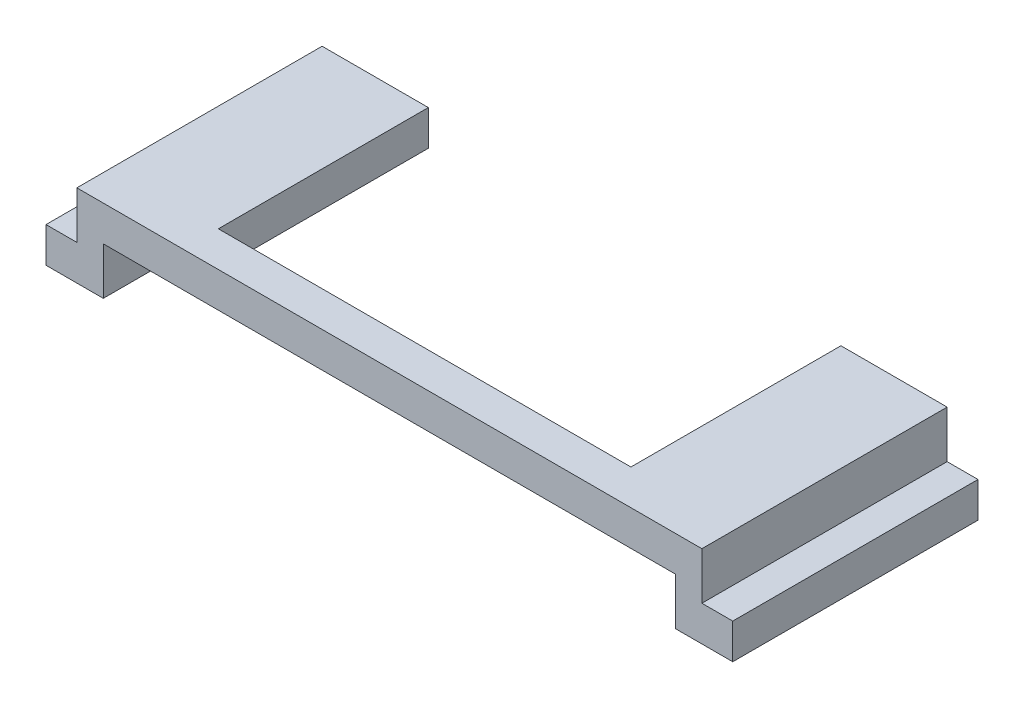
ISO-10303-21;
HEADER;
FILE_DESCRIPTION(('STEP AP214'),'2;1');
FILE_NAME('part.step','',(''),(''),'','','');
FILE_SCHEMA(('AUTOMOTIVE_DESIGN { 1 0 10303 214 1 1 1 1 }'));
ENDSEC;
DATA;
#1=APPLICATION_CONTEXT('core data for automotive mechanical design processes');
#2=APPLICATION_PROTOCOL_DEFINITION('international standard','automotive_design',2000,#1);
#3=PRODUCT_CONTEXT('',#1,'mechanical');
#4=PRODUCT('Part','Part','',(#3));
#5=PRODUCT_RELATED_PRODUCT_CATEGORY('part','',(#4));
#6=PRODUCT_DEFINITION_FORMATION('','',#4);
#7=PRODUCT_DEFINITION_CONTEXT('part definition',#1,'design');
#8=PRODUCT_DEFINITION('design','',#6,#7);
#9=PRODUCT_DEFINITION_SHAPE('','',#8);
#10=(LENGTH_UNIT() NAMED_UNIT(*) SI_UNIT(.MILLI.,.METRE.));
#11=(NAMED_UNIT(*) PLANE_ANGLE_UNIT() SI_UNIT($,.RADIAN.));
#12=(NAMED_UNIT(*) SI_UNIT($,.STERADIAN.) SOLID_ANGLE_UNIT());
#13=UNCERTAINTY_MEASURE_WITH_UNIT(LENGTH_MEASURE(1.E-05),#10,'distance_accuracy_value','');
#14=(GEOMETRIC_REPRESENTATION_CONTEXT(3) GLOBAL_UNCERTAINTY_ASSIGNED_CONTEXT((#13)) GLOBAL_UNIT_ASSIGNED_CONTEXT((#10,
#11,#12)) REPRESENTATION_CONTEXT('',''));
#15=CARTESIAN_POINT('',(0.,0.,0.));
#16=DIRECTION('',(0.,0.,1.));
#17=DIRECTION('',(1.,0.,0.));
#18=AXIS2_PLACEMENT_3D('',#15,#16,#17);
#19=CARTESIAN_POINT('',(0.,0.,0.));
#20=DIRECTION('',(0.,0.,-1.));
#21=DIRECTION('',(-1.,0.,0.));
#22=AXIS2_PLACEMENT_3D('',#19,#20,#21);
#23=PLANE('',#22);
#24=DIRECTION('',(1.,0.,0.));
#25=VECTOR('',#24,1.);
#26=CARTESIAN_POINT('',(-16.225,0.,0.));
#27=LINE('',#26,#25);
#28=CARTESIAN_POINT('',(11.7,0.,0.));
#29=VERTEX_POINT('',#28);
#30=CARTESIAN_POINT('',(16.225,0.,0.));
#31=VERTEX_POINT('',#30);
#32=EDGE_CURVE('E185',#29,#31,#27,.T.);
#33=ORIENTED_EDGE('',*,*,#32,.F.);
#34=DIRECTION('',(0.,1.,0.));
#35=VECTOR('',#34,1.);
#36=CARTESIAN_POINT('',(11.7,-2.68100000000001,0.));
#37=LINE('',#36,#35);
#38=CARTESIAN_POINT('',(11.7,2.,0.));
#39=VERTEX_POINT('',#38);
#40=EDGE_CURVE('E261',#29,#39,#37,.T.);
#41=ORIENTED_EDGE('',*,*,#40,.T.);
#42=DIRECTION('',(-1.,0.,0.));
#43=VECTOR('',#42,1.);
#44=CARTESIAN_POINT('',(-17.725,2.,0.));
#45=LINE('',#44,#43);
#46=CARTESIAN_POINT('',(17.725,2.,0.));
#47=VERTEX_POINT('',#46);
#48=EDGE_CURVE('E198',#47,#39,#45,.T.);
#49=ORIENTED_EDGE('',*,*,#48,.F.);
#50=DIRECTION('',(0.,1.,0.));
#51=VECTOR('',#50,1.);
#52=CARTESIAN_POINT('',(17.725,2.,0.));
#53=LINE('',#52,#51);
#54=CARTESIAN_POINT('',(17.725,-0.679999999999998,0.));
#55=VERTEX_POINT('',#54);
#56=EDGE_CURVE('E195',#55,#47,#53,.T.);
#57=ORIENTED_EDGE('',*,*,#56,.F.);
#58=DIRECTION('',(-1.,0.,0.));
#59=VECTOR('',#58,1.);
#60=CARTESIAN_POINT('',(17.725,-0.679999999999998,0.));
#61=LINE('',#60,#59);
#62=CARTESIAN_POINT('',(19.475,-0.679999999999999,0.));
#63=VERTEX_POINT('',#62);
#64=EDGE_CURVE('E194',#63,#55,#61,.T.);
#65=ORIENTED_EDGE('',*,*,#64,.F.);
#66=DIRECTION('',(0.,1.,0.));
#67=VECTOR('',#66,1.);
#68=CARTESIAN_POINT('',(19.475,-0.679999999999999,0.));
#69=LINE('',#68,#67);
#70=CARTESIAN_POINT('',(19.475,-2.68000000000001,0.));
#71=VERTEX_POINT('',#70);
#72=EDGE_CURVE('E188',#71,#63,#69,.T.);
#73=ORIENTED_EDGE('',*,*,#72,.F.);
#74=DIRECTION('',(1.,0.,0.));
#75=VECTOR('',#74,1.);
#76=CARTESIAN_POINT('',(16.225,-2.68,0.));
#77=LINE('',#76,#75);
#78=CARTESIAN_POINT('',(16.225,-2.68,0.));
#79=VERTEX_POINT('',#78);
#80=EDGE_CURVE('E190',#79,#71,#77,.T.);
#81=ORIENTED_EDGE('',*,*,#80,.F.);
#82=DIRECTION('',(0.,-1.,0.));
#83=VECTOR('',#82,1.);
#84=CARTESIAN_POINT('',(16.225,0.,0.));
#85=LINE('',#84,#83);
#86=EDGE_CURVE('E187',#31,#79,#85,.T.);
#87=ORIENTED_EDGE('',*,*,#86,.F.);
#88=EDGE_LOOP('',(#33,#41,#49,#57,#65,#73,#81,#87));
#89=FACE_BOUND('',#88,.T.);
#90=ADVANCED_FACE('F41',(#89),#23,.T.);
#91=CARTESIAN_POINT('',(-16.225,0.,13.91));
#92=DIRECTION('',(0.,1.,0.));
#93=DIRECTION('',(-1.,0.,0.));
#94=AXIS2_PLACEMENT_3D('',#91,#92,#93);
#95=PLANE('',#94);
#96=DIRECTION('',(0.,0.,1.));
#97=VECTOR('',#96,1.);
#98=CARTESIAN_POINT('',(11.7,0.,11.91));
#99=LINE('',#98,#97);
#100=CARTESIAN_POINT('',(11.7,0.,11.91));
#101=VERTEX_POINT('',#100);
#102=EDGE_CURVE('E263',#29,#101,#99,.T.);
#103=ORIENTED_EDGE('',*,*,#102,.F.);
#104=ORIENTED_EDGE('',*,*,#32,.T.);
#105=DIRECTION('',(0.,0.,-1.));
#106=VECTOR('',#105,1.);
#107=CARTESIAN_POINT('',(16.225,0.,13.91));
#108=LINE('',#107,#106);
#109=CARTESIAN_POINT('',(16.225,0.,13.91));
#110=VERTEX_POINT('',#109);
#111=EDGE_CURVE('E217',#110,#31,#108,.T.);
#112=ORIENTED_EDGE('',*,*,#111,.F.);
#113=DIRECTION('',(1.,0.,0.));
#114=VECTOR('',#113,1.);
#115=CARTESIAN_POINT('',(-16.225,0.,13.91));
#116=LINE('',#115,#114);
#117=CARTESIAN_POINT('',(-16.225,0.,13.91));
#118=VERTEX_POINT('',#117);
#119=EDGE_CURVE('E295',#118,#110,#116,.T.);
#120=ORIENTED_EDGE('',*,*,#119,.F.);
#121=DIRECTION('',(0.,0.,-1.));
#122=VECTOR('',#121,1.);
#123=CARTESIAN_POINT('',(-16.225,0.,13.91));
#124=LINE('',#123,#122);
#125=CARTESIAN_POINT('',(-16.225,0.,0.));
#126=VERTEX_POINT('',#125);
#127=EDGE_CURVE('E222',#118,#126,#124,.T.);
#128=ORIENTED_EDGE('',*,*,#127,.T.);
#129=CARTESIAN_POINT('',(-11.7,0.,0.));
#130=VERTEX_POINT('',#129);
#131=EDGE_CURVE('E181',#126,#130,#27,.T.);
#132=ORIENTED_EDGE('',*,*,#131,.T.);
#133=DIRECTION('',(0.,0.,-1.));
#134=VECTOR('',#133,1.);
#135=CARTESIAN_POINT('',(-11.7,0.,11.91));
#136=LINE('',#135,#134);
#137=CARTESIAN_POINT('',(-11.7,0.,11.91));
#138=VERTEX_POINT('',#137);
#139=EDGE_CURVE('E241',#138,#130,#136,.T.);
#140=ORIENTED_EDGE('',*,*,#139,.F.);
#141=DIRECTION('',(-1.,0.,0.));
#142=VECTOR('',#141,1.);
#143=CARTESIAN_POINT('',(-11.7,0.,11.91));
#144=LINE('',#143,#142);
#145=EDGE_CURVE('E275',#101,#138,#144,.T.);
#146=ORIENTED_EDGE('',*,*,#145,.F.);
#147=EDGE_LOOP('',(#103,#104,#112,#120,#128,#132,#140,#146));
#148=FACE_BOUND('',#147,.T.);
#149=ADVANCED_FACE('F238',(#148),#95,.F.);
#150=CARTESIAN_POINT('',(-17.725,2.,13.91));
#151=DIRECTION('',(0.,-1.,0.));
#152=DIRECTION('',(0.,0.,-1.));
#153=AXIS2_PLACEMENT_3D('',#150,#151,#152);
#154=PLANE('',#153);
#155=DIRECTION('',(0.,0.,-1.));
#156=VECTOR('',#155,1.);
#157=CARTESIAN_POINT('',(11.7,2.,11.91));
#158=LINE('',#157,#156);
#159=CARTESIAN_POINT('',(11.7,2.,11.91));
#160=VERTEX_POINT('',#159);
#161=EDGE_CURVE('E262',#160,#39,#158,.T.);
#162=ORIENTED_EDGE('',*,*,#161,.F.);
#163=DIRECTION('',(1.,0.,0.));
#164=VECTOR('',#163,1.);
#165=CARTESIAN_POINT('',(-11.7,2.,11.91));
#166=LINE('',#165,#164);
#167=CARTESIAN_POINT('',(-11.7,2.,11.91));
#168=VERTEX_POINT('',#167);
#169=EDGE_CURVE('E268',#168,#160,#166,.T.);
#170=ORIENTED_EDGE('',*,*,#169,.F.);
#171=DIRECTION('',(0.,0.,1.));
#172=VECTOR('',#171,1.);
#173=CARTESIAN_POINT('',(-11.7,2.,11.91));
#174=LINE('',#173,#172);
#175=CARTESIAN_POINT('',(-11.7,2.,0.));
#176=VERTEX_POINT('',#175);
#177=EDGE_CURVE('E57',#176,#168,#174,.T.);
#178=ORIENTED_EDGE('',*,*,#177,.F.);
#179=CARTESIAN_POINT('',(-17.725,2.,0.));
#180=VERTEX_POINT('',#179);
#181=EDGE_CURVE('E165',#176,#180,#45,.T.);
#182=ORIENTED_EDGE('',*,*,#181,.T.);
#183=DIRECTION('',(0.,0.,-1.));
#184=VECTOR('',#183,1.);
#185=CARTESIAN_POINT('',(-17.725,2.,13.91));
#186=LINE('',#185,#184);
#187=CARTESIAN_POINT('',(-17.725,2.,13.91));
#188=VERTEX_POINT('',#187);
#189=EDGE_CURVE('E158',#188,#180,#186,.T.);
#190=ORIENTED_EDGE('',*,*,#189,.F.);
#191=DIRECTION('',(-1.,0.,0.));
#192=VECTOR('',#191,1.);
#193=CARTESIAN_POINT('',(-17.725,2.,13.91));
#194=LINE('',#193,#192);
#195=CARTESIAN_POINT('',(17.725,2.,13.91));
#196=VERTEX_POINT('',#195);
#197=EDGE_CURVE('E144',#196,#188,#194,.T.);
#198=ORIENTED_EDGE('',*,*,#197,.F.);
#199=DIRECTION('',(0.,0.,-1.));
#200=VECTOR('',#199,1.);
#201=CARTESIAN_POINT('',(17.725,2.,13.91));
#202=LINE('',#201,#200);
#203=EDGE_CURVE('E164',#196,#47,#202,.T.);
#204=ORIENTED_EDGE('',*,*,#203,.T.);
#205=ORIENTED_EDGE('',*,*,#48,.T.);
#206=EDGE_LOOP('',(#162,#170,#178,#182,#190,#198,#204,#205));
#207=FACE_BOUND('',#206,.T.);
#208=ADVANCED_FACE('F159',(#207),#154,.F.);
#209=CARTESIAN_POINT('',(-19.475,-2.68000000000001,13.91));
#210=DIRECTION('',(1.,0.,0.));
#211=DIRECTION('',(0.,0.,-1.));
#212=AXIS2_PLACEMENT_3D('',#209,#210,#211);
#213=PLANE('',#212);
#214=DIRECTION('',(0.,-1.,0.));
#215=VECTOR('',#214,1.);
#216=CARTESIAN_POINT('',(-19.475,-2.68000000000001,0.));
#217=LINE('',#216,#215);
#218=CARTESIAN_POINT('',(-19.475,-0.679999999999999,0.));
#219=VERTEX_POINT('',#218);
#220=CARTESIAN_POINT('',(-19.475,-2.68000000000001,0.));
#221=VERTEX_POINT('',#220);
#222=EDGE_CURVE('E171',#219,#221,#217,.T.);
#223=ORIENTED_EDGE('',*,*,#222,.T.);
#224=DIRECTION('',(0.,0.,-1.));
#225=VECTOR('',#224,1.);
#226=CARTESIAN_POINT('',(-19.475,-2.68000000000001,13.91));
#227=LINE('',#226,#225);
#228=CARTESIAN_POINT('',(-19.475,-2.68000000000001,13.91));
#229=VERTEX_POINT('',#228);
#230=EDGE_CURVE('E11',#229,#221,#227,.T.);
#231=ORIENTED_EDGE('',*,*,#230,.F.);
#232=DIRECTION('',(0.,-1.,0.));
#233=VECTOR('',#232,1.);
#234=CARTESIAN_POINT('',(-19.475,-2.68000000000001,13.91));
#235=LINE('',#234,#233);
#236=CARTESIAN_POINT('',(-19.475,-0.679999999999999,13.91));
#237=VERTEX_POINT('',#236);
#238=EDGE_CURVE('E205',#237,#229,#235,.T.);
#239=ORIENTED_EDGE('',*,*,#238,.F.);
#240=DIRECTION('',(0.,0.,-1.));
#241=VECTOR('',#240,1.);
#242=CARTESIAN_POINT('',(-19.475,-0.679999999999999,13.91));
#243=LINE('',#242,#241);
#244=EDGE_CURVE('E168',#237,#219,#243,.T.);
#245=ORIENTED_EDGE('',*,*,#244,.T.);
#246=EDGE_LOOP('',(#223,#231,#239,#245));
#247=FACE_BOUND('',#246,.T.);
#248=ADVANCED_FACE('F43',(#247),#213,.F.);
#249=CARTESIAN_POINT('',(-19.475,-2.68000000000001,13.91));
#250=DIRECTION('',(0.,1.,0.));
#251=DIRECTION('',(-1.,0.,0.));
#252=AXIS2_PLACEMENT_3D('',#249,#250,#251);
#253=PLANE('',#252);
#254=DIRECTION('',(1.,0.,0.));
#255=VECTOR('',#254,1.);
#256=CARTESIAN_POINT('',(-19.475,-2.68000000000001,0.));
#257=LINE('',#256,#255);
#258=CARTESIAN_POINT('',(-16.225,-2.68,0.));
#259=VERTEX_POINT('',#258);
#260=EDGE_CURVE('E179',#221,#259,#257,.T.);
#261=ORIENTED_EDGE('',*,*,#260,.T.);
#262=DIRECTION('',(0.,0.,-1.));
#263=VECTOR('',#262,1.);
#264=CARTESIAN_POINT('',(-16.225,-2.68,13.91));
#265=LINE('',#264,#263);
#266=CARTESIAN_POINT('',(-16.225,-2.68,13.91));
#267=VERTEX_POINT('',#266);
#268=EDGE_CURVE('E47',#267,#259,#265,.T.);
#269=ORIENTED_EDGE('',*,*,#268,.F.);
#270=DIRECTION('',(1.,0.,0.));
#271=VECTOR('',#270,1.);
#272=CARTESIAN_POINT('',(-19.475,-2.68000000000001,13.91));
#273=LINE('',#272,#271);
#274=EDGE_CURVE('E120',#229,#267,#273,.T.);
#275=ORIENTED_EDGE('',*,*,#274,.F.);
#276=ORIENTED_EDGE('',*,*,#230,.T.);
#277=EDGE_LOOP('',(#261,#269,#275,#276));
#278=FACE_BOUND('',#277,.T.);
#279=ADVANCED_FACE('F363',(#278),#253,.F.);
#280=CARTESIAN_POINT('',(-16.225,-2.68,13.91));
#281=DIRECTION('',(-1.,0.,0.));
#282=DIRECTION('',(0.,0.,1.));
#283=AXIS2_PLACEMENT_3D('',#280,#281,#282);
#284=PLANE('',#283);
#285=DIRECTION('',(0.,1.,0.));
#286=VECTOR('',#285,1.);
#287=CARTESIAN_POINT('',(-16.225,-2.68,0.));
#288=LINE('',#287,#286);
#289=EDGE_CURVE('E176',#259,#126,#288,.T.);
#290=ORIENTED_EDGE('',*,*,#289,.T.);
#291=ORIENTED_EDGE('',*,*,#127,.F.);
#292=DIRECTION('',(0.,1.,0.));
#293=VECTOR('',#292,1.);
#294=CARTESIAN_POINT('',(-16.225,-2.68,13.91));
#295=LINE('',#294,#293);
#296=EDGE_CURVE('E226',#267,#118,#295,.T.);
#297=ORIENTED_EDGE('',*,*,#296,.F.);
#298=ORIENTED_EDGE('',*,*,#268,.T.);
#299=EDGE_LOOP('',(#290,#291,#297,#298));
#300=FACE_BOUND('',#299,.T.);
#301=ADVANCED_FACE('F229',(#300),#284,.F.);
#302=CARTESIAN_POINT('',(16.225,0.,13.91));
#303=DIRECTION('',(1.,0.,0.));
#304=DIRECTION('',(0.,0.,-1.));
#305=AXIS2_PLACEMENT_3D('',#302,#303,#304);
#306=PLANE('',#305);
#307=ORIENTED_EDGE('',*,*,#86,.T.);
#308=DIRECTION('',(0.,0.,-1.));
#309=VECTOR('',#308,1.);
#310=CARTESIAN_POINT('',(16.225,-2.68,13.91));
#311=LINE('',#310,#309);
#312=CARTESIAN_POINT('',(16.225,-2.68,13.91));
#313=VERTEX_POINT('',#312);
#314=EDGE_CURVE('E214',#313,#79,#311,.T.);
#315=ORIENTED_EDGE('',*,*,#314,.F.);
#316=DIRECTION('',(0.,-1.,0.));
#317=VECTOR('',#316,1.);
#318=CARTESIAN_POINT('',(16.225,0.,13.91));
#319=LINE('',#318,#317);
#320=EDGE_CURVE('E287',#110,#313,#319,.T.);
#321=ORIENTED_EDGE('',*,*,#320,.F.);
#322=ORIENTED_EDGE('',*,*,#111,.T.);
#323=EDGE_LOOP('',(#307,#315,#321,#322));
#324=FACE_BOUND('',#323,.T.);
#325=ADVANCED_FACE('F276',(#324),#306,.F.);
#326=CARTESIAN_POINT('',(16.225,-2.68,13.91));
#327=DIRECTION('',(0.,1.,0.));
#328=DIRECTION('',(-1.,0.,0.));
#329=AXIS2_PLACEMENT_3D('',#326,#327,#328);
#330=PLANE('',#329);
#331=ORIENTED_EDGE('',*,*,#80,.T.);
#332=DIRECTION('',(0.,0.,-1.));
#333=VECTOR('',#332,1.);
#334=CARTESIAN_POINT('',(19.475,-2.68000000000001,13.91));
#335=LINE('',#334,#333);
#336=CARTESIAN_POINT('',(19.475,-2.68000000000001,13.91));
#337=VERTEX_POINT('',#336);
#338=EDGE_CURVE('E215',#337,#71,#335,.T.);
#339=ORIENTED_EDGE('',*,*,#338,.F.);
#340=DIRECTION('',(1.,0.,0.));
#341=VECTOR('',#340,1.);
#342=CARTESIAN_POINT('',(16.225,-2.68,13.91));
#343=LINE('',#342,#341);
#344=EDGE_CURVE('E283',#313,#337,#343,.T.);
#345=ORIENTED_EDGE('',*,*,#344,.F.);
#346=ORIENTED_EDGE('',*,*,#314,.T.);
#347=EDGE_LOOP('',(#331,#339,#345,#346));
#348=FACE_BOUND('',#347,.T.);
#349=ADVANCED_FACE('F285',(#348),#330,.F.);
#350=CARTESIAN_POINT('',(19.475,-0.679999999999999,13.91));
#351=DIRECTION('',(-1.,0.,0.));
#352=DIRECTION('',(0.,0.,1.));
#353=AXIS2_PLACEMENT_3D('',#350,#351,#352);
#354=PLANE('',#353);
#355=ORIENTED_EDGE('',*,*,#72,.T.);
#356=DIRECTION('',(0.,0.,-1.));
#357=VECTOR('',#356,1.);
#358=CARTESIAN_POINT('',(19.475,-0.679999999999999,13.91));
#359=LINE('',#358,#357);
#360=CARTESIAN_POINT('',(19.475,-0.679999999999999,13.91));
#361=VERTEX_POINT('',#360);
#362=EDGE_CURVE('E207',#361,#63,#359,.T.);
#363=ORIENTED_EDGE('',*,*,#362,.F.);
#364=DIRECTION('',(0.,1.,0.));
#365=VECTOR('',#364,1.);
#366=CARTESIAN_POINT('',(19.475,-0.679999999999999,13.91));
#367=LINE('',#366,#365);
#368=EDGE_CURVE('E289',#337,#361,#367,.T.);
#369=ORIENTED_EDGE('',*,*,#368,.F.);
#370=ORIENTED_EDGE('',*,*,#338,.T.);
#371=EDGE_LOOP('',(#355,#363,#369,#370));
#372=FACE_BOUND('',#371,.T.);
#373=ADVANCED_FACE('F308',(#372),#354,.F.);
#374=CARTESIAN_POINT('',(17.725,-0.679999999999998,13.91));
#375=DIRECTION('',(0.,-1.,0.));
#376=DIRECTION('',(1.,0.,0.));
#377=AXIS2_PLACEMENT_3D('',#374,#375,#376);
#378=PLANE('',#377);
#379=ORIENTED_EDGE('',*,*,#64,.T.);
#380=DIRECTION('',(0.,0.,-1.));
#381=VECTOR('',#380,1.);
#382=CARTESIAN_POINT('',(17.725,-0.679999999999998,13.91));
#383=LINE('',#382,#381);
#384=CARTESIAN_POINT('',(17.725,-0.679999999999998,13.91));
#385=VERTEX_POINT('',#384);
#386=EDGE_CURVE('E206',#385,#55,#383,.T.);
#387=ORIENTED_EDGE('',*,*,#386,.F.);
#388=DIRECTION('',(-1.,0.,0.));
#389=VECTOR('',#388,1.);
#390=CARTESIAN_POINT('',(17.725,-0.679999999999998,13.91));
#391=LINE('',#390,#389);
#392=EDGE_CURVE('E286',#361,#385,#391,.T.);
#393=ORIENTED_EDGE('',*,*,#392,.F.);
#394=ORIENTED_EDGE('',*,*,#362,.T.);
#395=EDGE_LOOP('',(#379,#387,#393,#394));
#396=FACE_BOUND('',#395,.T.);
#397=ADVANCED_FACE('F298',(#396),#378,.F.);
#398=CARTESIAN_POINT('',(17.725,2.,13.91));
#399=DIRECTION('',(-1.,0.,0.));
#400=DIRECTION('',(0.,0.,1.));
#401=AXIS2_PLACEMENT_3D('',#398,#399,#400);
#402=PLANE('',#401);
#403=ORIENTED_EDGE('',*,*,#56,.T.);
#404=ORIENTED_EDGE('',*,*,#203,.F.);
#405=DIRECTION('',(0.,1.,0.));
#406=VECTOR('',#405,1.);
#407=CARTESIAN_POINT('',(17.725,2.,13.91));
#408=LINE('',#407,#406);
#409=EDGE_CURVE('E155',#385,#196,#408,.T.);
#410=ORIENTED_EDGE('',*,*,#409,.F.);
#411=ORIENTED_EDGE('',*,*,#386,.T.);
#412=EDGE_LOOP('',(#403,#404,#410,#411));
#413=FACE_BOUND('',#412,.T.);
#414=ADVANCED_FACE('F305',(#413),#402,.F.);
#415=CARTESIAN_POINT('',(-17.725,-0.679999999999998,13.91));
#416=DIRECTION('',(1.,0.,0.));
#417=DIRECTION('',(0.,0.,-1.));
#418=AXIS2_PLACEMENT_3D('',#415,#416,#417);
#419=PLANE('',#418);
#420=DIRECTION('',(0.,-1.,0.));
#421=VECTOR('',#420,1.);
#422=CARTESIAN_POINT('',(-17.725,-0.679999999999998,0.));
#423=LINE('',#422,#421);
#424=CARTESIAN_POINT('',(-17.725,-0.679999999999998,0.));
#425=VERTEX_POINT('',#424);
#426=EDGE_CURVE('E200',#180,#425,#423,.T.);
#427=ORIENTED_EDGE('',*,*,#426,.T.);
#428=DIRECTION('',(0.,0.,-1.));
#429=VECTOR('',#428,1.);
#430=CARTESIAN_POINT('',(-17.725,-0.679999999999998,13.91));
#431=LINE('',#430,#429);
#432=CARTESIAN_POINT('',(-17.725,-0.679999999999998,13.91));
#433=VERTEX_POINT('',#432);
#434=EDGE_CURVE('E167',#433,#425,#431,.T.);
#435=ORIENTED_EDGE('',*,*,#434,.F.);
#436=DIRECTION('',(0.,-1.,0.));
#437=VECTOR('',#436,1.);
#438=CARTESIAN_POINT('',(-17.725,-0.679999999999998,13.91));
#439=LINE('',#438,#437);
#440=EDGE_CURVE('E149',#188,#433,#439,.T.);
#441=ORIENTED_EDGE('',*,*,#440,.F.);
#442=ORIENTED_EDGE('',*,*,#189,.T.);
#443=EDGE_LOOP('',(#427,#435,#441,#442));
#444=FACE_BOUND('',#443,.T.);
#445=ADVANCED_FACE('F169',(#444),#419,.F.);
#446=CARTESIAN_POINT('',(-19.475,-0.679999999999999,13.91));
#447=DIRECTION('',(0.,-1.,0.));
#448=DIRECTION('',(1.,0.,0.));
#449=AXIS2_PLACEMENT_3D('',#446,#447,#448);
#450=PLANE('',#449);
#451=DIRECTION('',(-1.,0.,0.));
#452=VECTOR('',#451,1.);
#453=CARTESIAN_POINT('',(-19.475,-0.679999999999999,0.));
#454=LINE('',#453,#452);
#455=EDGE_CURVE('E109',#425,#219,#454,.T.);
#456=ORIENTED_EDGE('',*,*,#455,.T.);
#457=ORIENTED_EDGE('',*,*,#244,.F.);
#458=DIRECTION('',(-1.,0.,0.));
#459=VECTOR('',#458,1.);
#460=CARTESIAN_POINT('',(-19.475,-0.679999999999999,13.91));
#461=LINE('',#460,#459);
#462=EDGE_CURVE('E63',#433,#237,#461,.T.);
#463=ORIENTED_EDGE('',*,*,#462,.F.);
#464=ORIENTED_EDGE('',*,*,#434,.T.);
#465=EDGE_LOOP('',(#456,#457,#463,#464));
#466=FACE_BOUND('',#465,.T.);
#467=ADVANCED_FACE('F332',(#466),#450,.F.);
#468=CARTESIAN_POINT('',(0.,0.,13.91));
#469=DIRECTION('',(0.,0.,-1.));
#470=DIRECTION('',(-1.,0.,0.));
#471=AXIS2_PLACEMENT_3D('',#468,#469,#470);
#472=PLANE('',#471);
#473=ORIENTED_EDGE('',*,*,#238,.T.);
#474=ORIENTED_EDGE('',*,*,#274,.T.);
#475=ORIENTED_EDGE('',*,*,#296,.T.);
#476=ORIENTED_EDGE('',*,*,#119,.T.);
#477=ORIENTED_EDGE('',*,*,#320,.T.);
#478=ORIENTED_EDGE('',*,*,#344,.T.);
#479=ORIENTED_EDGE('',*,*,#368,.T.);
#480=ORIENTED_EDGE('',*,*,#392,.T.);
#481=ORIENTED_EDGE('',*,*,#409,.T.);
#482=ORIENTED_EDGE('',*,*,#197,.T.);
#483=ORIENTED_EDGE('',*,*,#440,.T.);
#484=ORIENTED_EDGE('',*,*,#462,.T.);
#485=EDGE_LOOP('',(#473,#474,#475,#476,#477,#478,#479,#480,#481,#482,#483,#484));
#486=FACE_BOUND('',#485,.T.);
#487=ADVANCED_FACE('F150',(#486),#472,.F.);
#488=DIRECTION('',(0.,1.,0.));
#489=VECTOR('',#488,1.);
#490=CARTESIAN_POINT('',(-11.7,-2.68100000000001,0.));
#491=LINE('',#490,#489);
#492=EDGE_CURVE('E237',#130,#176,#491,.T.);
#493=ORIENTED_EDGE('',*,*,#492,.F.);
#494=ORIENTED_EDGE('',*,*,#131,.F.);
#495=ORIENTED_EDGE('',*,*,#289,.F.);
#496=ORIENTED_EDGE('',*,*,#260,.F.);
#497=ORIENTED_EDGE('',*,*,#222,.F.);
#498=ORIENTED_EDGE('',*,*,#455,.F.);
#499=ORIENTED_EDGE('',*,*,#426,.F.);
#500=ORIENTED_EDGE('',*,*,#181,.F.);
#501=EDGE_LOOP('',(#493,#494,#495,#496,#497,#498,#499,#500));
#502=FACE_BOUND('',#501,.T.);
#503=ADVANCED_FACE('F232',(#502),#23,.T.);
#504=CARTESIAN_POINT('',(11.7,-2.68100000000001,11.91));
#505=DIRECTION('',(1.,0.,0.));
#506=DIRECTION('',(0.,0.,-1.));
#507=AXIS2_PLACEMENT_3D('',#504,#505,#506);
#508=PLANE('',#507);
#509=ORIENTED_EDGE('',*,*,#102,.T.);
#510=DIRECTION('',(0.,1.,0.));
#511=VECTOR('',#510,1.);
#512=CARTESIAN_POINT('',(11.7,-2.68100000000001,11.91));
#513=LINE('',#512,#511);
#514=EDGE_CURVE('E177',#101,#160,#513,.T.);
#515=ORIENTED_EDGE('',*,*,#514,.T.);
#516=ORIENTED_EDGE('',*,*,#161,.T.);
#517=ORIENTED_EDGE('',*,*,#40,.F.);
#518=EDGE_LOOP('',(#509,#515,#516,#517));
#519=FACE_BOUND('',#518,.T.);
#520=ADVANCED_FACE('F265',(#519),#508,.F.);
#521=CARTESIAN_POINT('',(-11.7,-2.68100000000001,11.91));
#522=DIRECTION('',(0.,0.,1.));
#523=DIRECTION('',(1.,0.,0.));
#524=AXIS2_PLACEMENT_3D('',#521,#522,#523);
#525=PLANE('',#524);
#526=ORIENTED_EDGE('',*,*,#145,.T.);
#527=DIRECTION('',(0.,1.,0.));
#528=VECTOR('',#527,1.);
#529=CARTESIAN_POINT('',(-11.7,-2.68100000000001,11.91));
#530=LINE('',#529,#528);
#531=EDGE_CURVE('E341',#138,#168,#530,.T.);
#532=ORIENTED_EDGE('',*,*,#531,.T.);
#533=ORIENTED_EDGE('',*,*,#169,.T.);
#534=ORIENTED_EDGE('',*,*,#514,.F.);
#535=EDGE_LOOP('',(#526,#532,#533,#534));
#536=FACE_BOUND('',#535,.T.);
#537=ADVANCED_FACE('F328',(#536),#525,.F.);
#538=CARTESIAN_POINT('',(-11.7,-2.68100000000001,11.91));
#539=DIRECTION('',(-1.,0.,0.));
#540=DIRECTION('',(0.,0.,1.));
#541=AXIS2_PLACEMENT_3D('',#538,#539,#540);
#542=PLANE('',#541);
#543=ORIENTED_EDGE('',*,*,#139,.T.);
#544=ORIENTED_EDGE('',*,*,#492,.T.);
#545=ORIENTED_EDGE('',*,*,#177,.T.);
#546=ORIENTED_EDGE('',*,*,#531,.F.);
#547=EDGE_LOOP('',(#543,#544,#545,#546));
#548=FACE_BOUND('',#547,.T.);
#549=ADVANCED_FACE('F337',(#548),#542,.F.);
#550=CLOSED_SHELL('',(#90,#149,#208,#248,#279,#301,#325,#349,#373,#397,#414,#445,#467,#487,#503,
#520,#537,#549));
#551=MANIFOLD_SOLID_BREP('B2',#550);
#552=ADVANCED_BREP_SHAPE_REPRESENTATION('',(#18,#551),#14);
#553=SHAPE_DEFINITION_REPRESENTATION(#9,#552);
ENDSEC;
END-ISO-10303-21;
